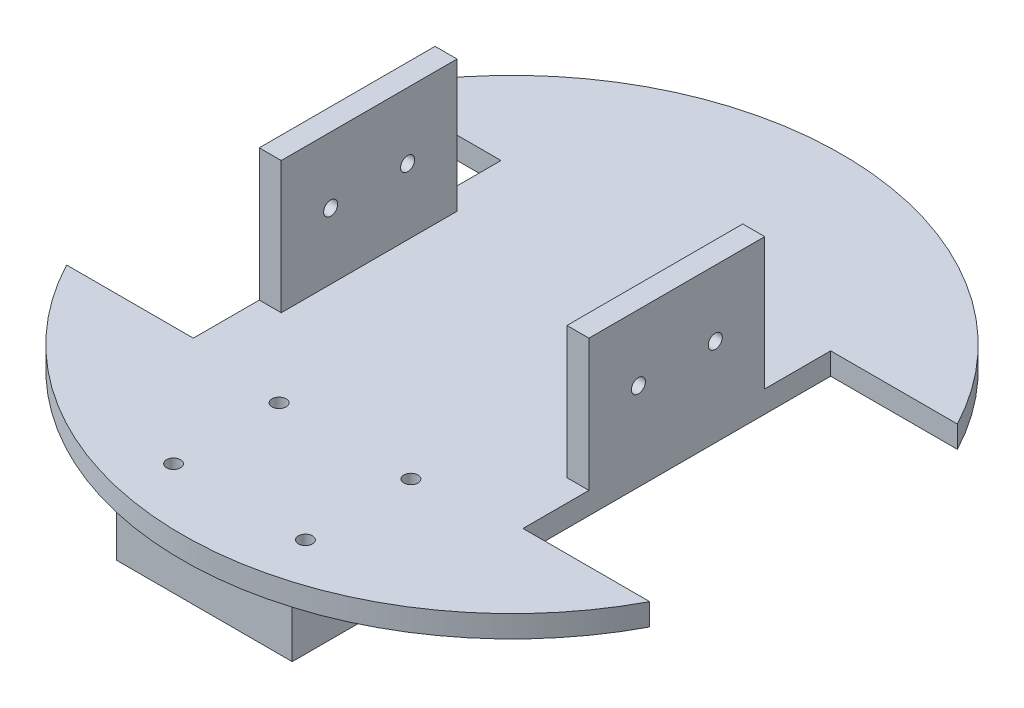
ISO-10303-21;
HEADER;
FILE_DESCRIPTION(('STEP AP214'),'2;1');
FILE_NAME('part.step','',(''),(''),'','','');
FILE_SCHEMA(('AUTOMOTIVE_DESIGN { 1 0 10303 214 1 1 1 1 }'));
ENDSEC;
DATA;
#1=APPLICATION_CONTEXT('core data for automotive mechanical design processes');
#2=APPLICATION_PROTOCOL_DEFINITION('international standard','automotive_design',2000,#1);
#3=PRODUCT_CONTEXT('',#1,'mechanical');
#4=PRODUCT('Part','Part','',(#3));
#5=PRODUCT_RELATED_PRODUCT_CATEGORY('part','',(#4));
#6=PRODUCT_DEFINITION_FORMATION('','',#4);
#7=PRODUCT_DEFINITION_CONTEXT('part definition',#1,'design');
#8=PRODUCT_DEFINITION('design','',#6,#7);
#9=PRODUCT_DEFINITION_SHAPE('','',#8);
#10=(LENGTH_UNIT() NAMED_UNIT(*) SI_UNIT(.MILLI.,.METRE.));
#11=(NAMED_UNIT(*) PLANE_ANGLE_UNIT() SI_UNIT($,.RADIAN.));
#12=(NAMED_UNIT(*) SI_UNIT($,.STERADIAN.) SOLID_ANGLE_UNIT());
#13=UNCERTAINTY_MEASURE_WITH_UNIT(LENGTH_MEASURE(1.E-05),#10,'distance_accuracy_value','');
#14=(GEOMETRIC_REPRESENTATION_CONTEXT(3) GLOBAL_UNCERTAINTY_ASSIGNED_CONTEXT((#13)) GLOBAL_UNIT_ASSIGNED_CONTEXT((#10,
#11,#12)) REPRESENTATION_CONTEXT('',''));
#15=CARTESIAN_POINT('',(0.,0.,0.));
#16=DIRECTION('',(0.,0.,1.));
#17=DIRECTION('',(1.,0.,0.));
#18=AXIS2_PLACEMENT_3D('',#15,#16,#17);
#19=CARTESIAN_POINT('',(0.,0.,0.));
#20=DIRECTION('',(0.,1.,0.));
#21=DIRECTION('',(0.,0.,1.));
#22=AXIS2_PLACEMENT_3D('',#19,#20,#21);
#23=PLANE('',#22);
#24=DIRECTION('',(0.,0.,1.));
#25=VECTOR('',#24,1.);
#26=CARTESIAN_POINT('',(37.5,0.,-35.));
#27=LINE('',#26,#25);
#28=CARTESIAN_POINT('',(37.5,0.,-35.));
#29=VERTEX_POINT('',#28);
#30=CARTESIAN_POINT('',(37.5,0.,35.));
#31=VERTEX_POINT('',#30);
#32=EDGE_CURVE('E362',#29,#31,#27,.T.);
#33=ORIENTED_EDGE('',*,*,#32,.T.);
#34=DIRECTION('',(1.,0.,0.));
#35=VECTOR('',#34,1.);
#36=CARTESIAN_POINT('',(37.5,0.,35.));
#37=LINE('',#36,#35);
#38=CARTESIAN_POINT('',(66.332495807108,0.,35.));
#39=VERTEX_POINT('',#38);
#40=EDGE_CURVE('E365',#31,#39,#37,.T.);
#41=ORIENTED_EDGE('',*,*,#40,.T.);
#42=CARTESIAN_POINT('',(0.,0.,0.));
#43=DIRECTION('',(0.,1.,0.));
#44=DIRECTION('',(0.,0.,1.));
#45=AXIS2_PLACEMENT_3D('',#42,#43,#44);
#46=CIRCLE('',#45,75.);
#47=CARTESIAN_POINT('',(-66.332495807108,0.,35.));
#48=VERTEX_POINT('',#47);
#49=EDGE_CURVE('E413',#48,#39,#46,.T.);
#50=ORIENTED_EDGE('',*,*,#49,.F.);
#51=DIRECTION('',(1.,0.,0.));
#52=VECTOR('',#51,1.);
#53=CARTESIAN_POINT('',(0.,0.,35.));
#54=LINE('',#53,#52);
#55=CARTESIAN_POINT('',(-37.5,0.,35.));
#56=VERTEX_POINT('',#55);
#57=EDGE_CURVE('E122',#48,#56,#54,.T.);
#58=ORIENTED_EDGE('',*,*,#57,.T.);
#59=DIRECTION('',(0.,0.,-1.));
#60=VECTOR('',#59,1.);
#61=CARTESIAN_POINT('',(-37.5,0.,-35.));
#62=LINE('',#61,#60);
#63=CARTESIAN_POINT('',(-37.5,0.,-35.));
#64=VERTEX_POINT('',#63);
#65=EDGE_CURVE('E387',#56,#64,#62,.T.);
#66=ORIENTED_EDGE('',*,*,#65,.T.);
#67=DIRECTION('',(-1.,0.,0.));
#68=VECTOR('',#67,1.);
#69=CARTESIAN_POINT('',(-37.5,0.,-35.));
#70=LINE('',#69,#68);
#71=CARTESIAN_POINT('',(-66.332495807108,0.,-35.));
#72=VERTEX_POINT('',#71);
#73=EDGE_CURVE('E399',#64,#72,#70,.T.);
#74=ORIENTED_EDGE('',*,*,#73,.T.);
#75=CARTESIAN_POINT('',(66.332495807108,0.,-35.));
#76=VERTEX_POINT('',#75);
#77=EDGE_CURVE('E418',#76,#72,#46,.T.);
#78=ORIENTED_EDGE('',*,*,#77,.F.);
#79=DIRECTION('',(-1.,0.,0.));
#80=VECTOR('',#79,1.);
#81=CARTESIAN_POINT('',(0.,0.,-35.));
#82=LINE('',#81,#80);
#83=EDGE_CURVE('E12',#76,#29,#82,.T.);
#84=ORIENTED_EDGE('',*,*,#83,.T.);
#85=EDGE_LOOP('',(#33,#41,#50,#58,#66,#74,#78,#84));
#86=FACE_BOUND('',#85,.T.);
#87=DIRECTION('',(0.,0.,1.));
#88=VECTOR('',#87,1.);
#89=CARTESIAN_POINT('',(20.,0.,70.));
#90=LINE('',#89,#88);
#91=CARTESIAN_POINT('',(20.,0.,30.));
#92=VERTEX_POINT('',#91);
#93=CARTESIAN_POINT('',(20.,0.,70.));
#94=VERTEX_POINT('',#93);
#95=EDGE_CURVE('E271',#92,#94,#90,.T.);
#96=ORIENTED_EDGE('',*,*,#95,.F.);
#97=DIRECTION('',(1.,0.,0.));
#98=VECTOR('',#97,1.);
#99=CARTESIAN_POINT('',(-20.,0.,30.));
#100=LINE('',#99,#98);
#101=CARTESIAN_POINT('',(-20.,0.,30.));
#102=VERTEX_POINT('',#101);
#103=EDGE_CURVE('E268',#102,#92,#100,.T.);
#104=ORIENTED_EDGE('',*,*,#103,.F.);
#105=DIRECTION('',(0.,0.,-1.));
#106=VECTOR('',#105,1.);
#107=CARTESIAN_POINT('',(-20.,0.,70.));
#108=LINE('',#107,#106);
#109=CARTESIAN_POINT('',(-20.,0.,70.));
#110=VERTEX_POINT('',#109);
#111=EDGE_CURVE('E134',#110,#102,#108,.T.);
#112=ORIENTED_EDGE('',*,*,#111,.F.);
#113=DIRECTION('',(-1.,0.,0.));
#114=VECTOR('',#113,1.);
#115=CARTESIAN_POINT('',(-20.,0.,70.));
#116=LINE('',#115,#114);
#117=EDGE_CURVE('E129',#94,#110,#116,.T.);
#118=ORIENTED_EDGE('',*,*,#117,.F.);
#119=EDGE_LOOP('',(#96,#104,#112,#118));
#120=FACE_BOUND('',#119,.T.);
#121=ADVANCED_FACE('F114',(#86,#120),#23,.F.);
#122=CARTESIAN_POINT('',(0.,4.99999999999998,0.));
#123=DIRECTION('',(0.,1.,0.));
#124=DIRECTION('',(0.,0.,1.));
#125=AXIS2_PLACEMENT_3D('',#122,#123,#124);
#126=PLANE('',#125);
#127=CARTESIAN_POINT('',(15.,4.99999999999998,62.));
#128=DIRECTION('',(0.,1.,0.));
#129=DIRECTION('',(0.,0.,1.));
#130=AXIS2_PLACEMENT_3D('',#127,#128,#129);
#131=CIRCLE('',#130,1.60000000000001);
#132=CARTESIAN_POINT('',(15.,4.99999999999998,63.6));
#133=VERTEX_POINT('',#132);
#134=EDGE_CURVE('E732',#133,#133,#131,.T.);
#135=ORIENTED_EDGE('',*,*,#134,.F.);
#136=EDGE_LOOP('',(#135));
#137=FACE_BOUND('',#136,.T.);
#138=CARTESIAN_POINT('',(-15.,4.99999999999998,38.));
#139=DIRECTION('',(0.,1.,0.));
#140=DIRECTION('',(0.,0.,1.));
#141=AXIS2_PLACEMENT_3D('',#138,#139,#140);
#142=CIRCLE('',#141,1.6);
#143=CARTESIAN_POINT('',(-15.,4.99999999999998,39.6));
#144=VERTEX_POINT('',#143);
#145=EDGE_CURVE('E752',#144,#144,#142,.T.);
#146=ORIENTED_EDGE('',*,*,#145,.F.);
#147=EDGE_LOOP('',(#146));
#148=FACE_BOUND('',#147,.T.);
#149=CARTESIAN_POINT('',(15.,4.99999999999998,38.));
#150=DIRECTION('',(0.,1.,0.));
#151=DIRECTION('',(0.,0.,1.));
#152=AXIS2_PLACEMENT_3D('',#149,#150,#151);
#153=CIRCLE('',#152,1.6);
#154=CARTESIAN_POINT('',(15.,4.99999999999998,39.6));
#155=VERTEX_POINT('',#154);
#156=EDGE_CURVE('E749',#155,#155,#153,.T.);
#157=ORIENTED_EDGE('',*,*,#156,.F.);
#158=EDGE_LOOP('',(#157));
#159=FACE_BOUND('',#158,.T.);
#160=CARTESIAN_POINT('',(-15.,4.99999999999998,62.));
#161=DIRECTION('',(0.,1.,0.));
#162=DIRECTION('',(0.,0.,1.));
#163=AXIS2_PLACEMENT_3D('',#160,#161,#162);
#164=CIRCLE('',#163,1.6);
#165=CARTESIAN_POINT('',(-15.,4.99999999999998,63.6));
#166=VERTEX_POINT('',#165);
#167=EDGE_CURVE('E740',#166,#166,#164,.T.);
#168=ORIENTED_EDGE('',*,*,#167,.F.);
#169=EDGE_LOOP('',(#168));
#170=FACE_BOUND('',#169,.T.);
#171=DIRECTION('',(1.,0.,0.));
#172=VECTOR('',#171,1.);
#173=CARTESIAN_POINT('',(37.5,4.99999999999998,-20.));
#174=LINE('',#173,#172);
#175=CARTESIAN_POINT('',(32.5,4.99999999999998,-20.));
#176=VERTEX_POINT('',#175);
#177=CARTESIAN_POINT('',(37.5,4.99999999999998,-20.));
#178=VERTEX_POINT('',#177);
#179=EDGE_CURVE('E289',#176,#178,#174,.T.);
#180=ORIENTED_EDGE('',*,*,#179,.T.);
#181=DIRECTION('',(0.,0.,1.));
#182=VECTOR('',#181,1.);
#183=CARTESIAN_POINT('',(37.5,4.99999999999998,-35.));
#184=LINE('',#183,#182);
#185=CARTESIAN_POINT('',(37.5,4.99999999999998,-35.));
#186=VERTEX_POINT('',#185);
#187=EDGE_CURVE('E374',#186,#178,#184,.T.);
#188=ORIENTED_EDGE('',*,*,#187,.F.);
#189=DIRECTION('',(-1.,0.,0.));
#190=VECTOR('',#189,1.);
#191=CARTESIAN_POINT('',(37.5,4.99999999999998,-35.));
#192=LINE('',#191,#190);
#193=CARTESIAN_POINT('',(66.332495807108,4.99999999999998,-35.));
#194=VERTEX_POINT('',#193);
#195=EDGE_CURVE('E370',#194,#186,#192,.T.);
#196=ORIENTED_EDGE('',*,*,#195,.F.);
#197=CARTESIAN_POINT('',(0.,4.99999999999998,0.));
#198=DIRECTION('',(0.,1.,0.));
#199=DIRECTION('',(0.,0.,1.));
#200=AXIS2_PLACEMENT_3D('',#197,#198,#199);
#201=CIRCLE('',#200,75.);
#202=CARTESIAN_POINT('',(-66.332495807108,4.99999999999998,-35.));
#203=VERTEX_POINT('',#202);
#204=EDGE_CURVE('E417',#194,#203,#201,.T.);
#205=ORIENTED_EDGE('',*,*,#204,.T.);
#206=DIRECTION('',(-1.,0.,0.));
#207=VECTOR('',#206,1.);
#208=CARTESIAN_POINT('',(-37.5,4.99999999999998,-35.));
#209=LINE('',#208,#207);
#210=CARTESIAN_POINT('',(-37.5,4.99999999999998,-35.));
#211=VERTEX_POINT('',#210);
#212=EDGE_CURVE('E373',#211,#203,#209,.T.);
#213=ORIENTED_EDGE('',*,*,#212,.F.);
#214=DIRECTION('',(0.,0.,-1.));
#215=VECTOR('',#214,1.);
#216=CARTESIAN_POINT('',(-37.5,4.99999999999998,-35.));
#217=LINE('',#216,#215);
#218=CARTESIAN_POINT('',(-37.5,4.99999999999998,-20.));
#219=VERTEX_POINT('',#218);
#220=EDGE_CURVE('E394',#219,#211,#217,.T.);
#221=ORIENTED_EDGE('',*,*,#220,.F.);
#222=DIRECTION('',(-1.,0.,0.));
#223=VECTOR('',#222,1.);
#224=CARTESIAN_POINT('',(-37.5,4.99999999999998,-20.));
#225=LINE('',#224,#223);
#226=CARTESIAN_POINT('',(-32.5,4.99999999999998,-20.));
#227=VERTEX_POINT('',#226);
#228=EDGE_CURVE('E336',#227,#219,#225,.T.);
#229=ORIENTED_EDGE('',*,*,#228,.F.);
#230=DIRECTION('',(0.,0.,-1.));
#231=VECTOR('',#230,1.);
#232=CARTESIAN_POINT('',(-32.5,4.99999999999998,-20.));
#233=LINE('',#232,#231);
#234=CARTESIAN_POINT('',(-32.5,4.99999999999998,20.));
#235=VERTEX_POINT('',#234);
#236=EDGE_CURVE('E345',#235,#227,#233,.T.);
#237=ORIENTED_EDGE('',*,*,#236,.F.);
#238=DIRECTION('',(1.,0.,0.));
#239=VECTOR('',#238,1.);
#240=CARTESIAN_POINT('',(-37.5,4.99999999999998,20.));
#241=LINE('',#240,#239);
#242=CARTESIAN_POINT('',(-37.5,4.99999999999998,20.));
#243=VERTEX_POINT('',#242);
#244=EDGE_CURVE('E331',#243,#235,#241,.T.);
#245=ORIENTED_EDGE('',*,*,#244,.F.);
#246=CARTESIAN_POINT('',(-37.5,4.99999999999998,35.));
#247=VERTEX_POINT('',#246);
#248=EDGE_CURVE('E390',#247,#243,#217,.T.);
#249=ORIENTED_EDGE('',*,*,#248,.F.);
#250=DIRECTION('',(1.,0.,0.));
#251=VECTOR('',#250,1.);
#252=CARTESIAN_POINT('',(-37.5,4.99999999999998,35.));
#253=LINE('',#252,#251);
#254=CARTESIAN_POINT('',(-66.332495807108,4.99999999999998,35.));
#255=VERTEX_POINT('',#254);
#256=EDGE_CURVE('E393',#255,#247,#253,.T.);
#257=ORIENTED_EDGE('',*,*,#256,.F.);
#258=CARTESIAN_POINT('',(66.332495807108,4.99999999999998,35.));
#259=VERTEX_POINT('',#258);
#260=EDGE_CURVE('E414',#255,#259,#201,.T.);
#261=ORIENTED_EDGE('',*,*,#260,.T.);
#262=DIRECTION('',(1.,0.,0.));
#263=VECTOR('',#262,1.);
#264=CARTESIAN_POINT('',(37.5,4.99999999999998,35.));
#265=LINE('',#264,#263);
#266=CARTESIAN_POINT('',(37.5,4.99999999999998,35.));
#267=VERTEX_POINT('',#266);
#268=EDGE_CURVE('E366',#267,#259,#265,.T.);
#269=ORIENTED_EDGE('',*,*,#268,.F.);
#270=CARTESIAN_POINT('',(37.5,4.99999999999998,20.));
#271=VERTEX_POINT('',#270);
#272=EDGE_CURVE('E372',#271,#267,#184,.T.);
#273=ORIENTED_EDGE('',*,*,#272,.F.);
#274=DIRECTION('',(-1.,0.,0.));
#275=VECTOR('',#274,1.);
#276=CARTESIAN_POINT('',(37.5,4.99999999999998,20.));
#277=LINE('',#276,#275);
#278=CARTESIAN_POINT('',(32.5,4.99999999999998,20.));
#279=VERTEX_POINT('',#278);
#280=EDGE_CURVE('E294',#271,#279,#277,.T.);
#281=ORIENTED_EDGE('',*,*,#280,.T.);
#282=DIRECTION('',(0.,0.,-1.));
#283=VECTOR('',#282,1.);
#284=CARTESIAN_POINT('',(32.5,4.99999999999998,-20.));
#285=LINE('',#284,#283);
#286=EDGE_CURVE('E306',#279,#176,#285,.T.);
#287=ORIENTED_EDGE('',*,*,#286,.T.);
#288=EDGE_LOOP('',(#180,#188,#196,#205,#213,#221,#229,#237,#245,#249,#257,#261,#269,#273,#281,#287));
#289=FACE_BOUND('',#288,.T.);
#290=ADVANCED_FACE('F428',(#137,#148,#159,#170,#289),#126,.T.);
#291=CARTESIAN_POINT('',(0.,4.99999999999998,0.));
#292=DIRECTION('',(0.,-1.,0.));
#293=DIRECTION('',(0.,0.,-1.));
#294=AXIS2_PLACEMENT_3D('',#291,#292,#293);
#295=CYLINDRICAL_SURFACE('',#294,75.);
#296=ORIENTED_EDGE('',*,*,#49,.T.);
#297=DIRECTION('',(0.,-1.,0.));
#298=VECTOR('',#297,1.);
#299=CARTESIAN_POINT('',(66.332495807108,4.99999999999998,35.));
#300=LINE('',#299,#298);
#301=EDGE_CURVE('E410',#39,#259,#300,.F.);
#302=ORIENTED_EDGE('',*,*,#301,.T.);
#303=ORIENTED_EDGE('',*,*,#260,.F.);
#304=DIRECTION('',(0.,-1.,0.));
#305=VECTOR('',#304,1.);
#306=CARTESIAN_POINT('',(-66.332495807108,4.99999999999998,35.));
#307=LINE('',#306,#305);
#308=EDGE_CURVE('E381',#255,#48,#307,.T.);
#309=ORIENTED_EDGE('',*,*,#308,.T.);
#310=EDGE_LOOP('',(#296,#302,#303,#309));
#311=FACE_BOUND('',#310,.T.);
#312=ADVANCED_FACE('F116',(#311),#295,.T.);
#313=ORIENTED_EDGE('',*,*,#204,.F.);
#314=DIRECTION('',(0.,-1.,0.));
#315=VECTOR('',#314,1.);
#316=CARTESIAN_POINT('',(66.332495807108,4.99999999999998,-35.));
#317=LINE('',#316,#315);
#318=EDGE_CURVE('E407',#194,#76,#317,.T.);
#319=ORIENTED_EDGE('',*,*,#318,.T.);
#320=ORIENTED_EDGE('',*,*,#77,.T.);
#321=DIRECTION('',(0.,-1.,0.));
#322=VECTOR('',#321,1.);
#323=CARTESIAN_POINT('',(-66.332495807108,4.99999999999998,-35.));
#324=LINE('',#323,#322);
#325=EDGE_CURVE('E404',#72,#203,#324,.F.);
#326=ORIENTED_EDGE('',*,*,#325,.T.);
#327=EDGE_LOOP('',(#313,#319,#320,#326));
#328=FACE_BOUND('',#327,.T.);
#329=ADVANCED_FACE('F431',(#328),#295,.T.);
#330=CARTESIAN_POINT('',(-37.5,0.,-35.));
#331=DIRECTION('',(0.,0.,-1.));
#332=DIRECTION('',(-1.,0.,0.));
#333=AXIS2_PLACEMENT_3D('',#330,#331,#332);
#334=PLANE('',#333);
#335=ORIENTED_EDGE('',*,*,#73,.F.);
#336=DIRECTION('',(0.,1.,0.));
#337=VECTOR('',#336,1.);
#338=CARTESIAN_POINT('',(-37.5,0.,-35.));
#339=LINE('',#338,#337);
#340=EDGE_CURVE('E361',#64,#211,#339,.T.);
#341=ORIENTED_EDGE('',*,*,#340,.T.);
#342=ORIENTED_EDGE('',*,*,#212,.T.);
#343=ORIENTED_EDGE('',*,*,#325,.F.);
#344=EDGE_LOOP('',(#335,#341,#342,#343));
#345=FACE_BOUND('',#344,.T.);
#346=ADVANCED_FACE('F436',(#345),#334,.F.);
#347=CARTESIAN_POINT('',(-37.5,0.,35.));
#348=DIRECTION('',(0.,0.,1.));
#349=DIRECTION('',(1.,0.,0.));
#350=AXIS2_PLACEMENT_3D('',#347,#348,#349);
#351=PLANE('',#350);
#352=ORIENTED_EDGE('',*,*,#256,.T.);
#353=DIRECTION('',(0.,1.,0.));
#354=VECTOR('',#353,1.);
#355=CARTESIAN_POINT('',(-37.5,0.,35.));
#356=LINE('',#355,#354);
#357=EDGE_CURVE('E384',#56,#247,#356,.T.);
#358=ORIENTED_EDGE('',*,*,#357,.F.);
#359=ORIENTED_EDGE('',*,*,#57,.F.);
#360=ORIENTED_EDGE('',*,*,#308,.F.);
#361=EDGE_LOOP('',(#352,#358,#359,#360));
#362=FACE_BOUND('',#361,.T.);
#363=ADVANCED_FACE('F442',(#362),#351,.F.);
#364=CARTESIAN_POINT('',(-37.5,0.,-35.));
#365=DIRECTION('',(1.,0.,0.));
#366=DIRECTION('',(0.,0.,-1.));
#367=AXIS2_PLACEMENT_3D('',#364,#365,#366);
#368=PLANE('',#367);
#369=CARTESIAN_POINT('',(-37.5,20.,8.75));
#370=DIRECTION('',(1.,0.,0.));
#371=DIRECTION('',(0.,0.,-1.));
#372=AXIS2_PLACEMENT_3D('',#369,#370,#371);
#373=CIRCLE('',#372,1.6);
#374=CARTESIAN_POINT('',(-37.5,20.,7.15));
#375=VERTEX_POINT('',#374);
#376=EDGE_CURVE('E328',#375,#375,#373,.T.);
#377=ORIENTED_EDGE('',*,*,#376,.T.);
#378=EDGE_LOOP('',(#377));
#379=FACE_BOUND('',#378,.T.);
#380=CARTESIAN_POINT('',(-37.5,20.,-8.75));
#381=DIRECTION('',(1.,0.,0.));
#382=DIRECTION('',(0.,0.,-1.));
#383=AXIS2_PLACEMENT_3D('',#380,#381,#382);
#384=CIRCLE('',#383,1.6);
#385=CARTESIAN_POINT('',(-37.5,20.,-10.35));
#386=VERTEX_POINT('',#385);
#387=EDGE_CURVE('E323',#386,#386,#384,.T.);
#388=ORIENTED_EDGE('',*,*,#387,.T.);
#389=EDGE_LOOP('',(#388));
#390=FACE_BOUND('',#389,.T.);
#391=ORIENTED_EDGE('',*,*,#248,.T.);
#392=DIRECTION('',(0.,-1.,0.));
#393=VECTOR('',#392,1.);
#394=CARTESIAN_POINT('',(-37.5,35.,20.));
#395=LINE('',#394,#393);
#396=CARTESIAN_POINT('',(-37.5,35.,20.));
#397=VERTEX_POINT('',#396);
#398=EDGE_CURVE('E358',#397,#243,#395,.T.);
#399=ORIENTED_EDGE('',*,*,#398,.F.);
#400=DIRECTION('',(0.,0.,1.));
#401=VECTOR('',#400,1.);
#402=CARTESIAN_POINT('',(-37.5,35.,-20.));
#403=LINE('',#402,#401);
#404=CARTESIAN_POINT('',(-37.5,35.,-20.));
#405=VERTEX_POINT('',#404);
#406=EDGE_CURVE('E332',#405,#397,#403,.T.);
#407=ORIENTED_EDGE('',*,*,#406,.F.);
#408=DIRECTION('',(0.,-1.,0.));
#409=VECTOR('',#408,1.);
#410=CARTESIAN_POINT('',(-37.5,35.,-20.));
#411=LINE('',#410,#409);
#412=EDGE_CURVE('E342',#405,#219,#411,.T.);
#413=ORIENTED_EDGE('',*,*,#412,.T.);
#414=ORIENTED_EDGE('',*,*,#220,.T.);
#415=ORIENTED_EDGE('',*,*,#340,.F.);
#416=ORIENTED_EDGE('',*,*,#65,.F.);
#417=ORIENTED_EDGE('',*,*,#357,.T.);
#418=EDGE_LOOP('',(#391,#399,#407,#413,#414,#415,#416,#417));
#419=FACE_BOUND('',#418,.T.);
#420=ADVANCED_FACE('F439',(#379,#390,#419),#368,.F.);
#421=CARTESIAN_POINT('',(37.5,0.,-35.));
#422=DIRECTION('',(0.,0.,-1.));
#423=DIRECTION('',(-1.,0.,0.));
#424=AXIS2_PLACEMENT_3D('',#421,#422,#423);
#425=PLANE('',#424);
#426=ORIENTED_EDGE('',*,*,#195,.T.);
#427=DIRECTION('',(0.,1.,0.));
#428=VECTOR('',#427,1.);
#429=CARTESIAN_POINT('',(37.5,0.,-35.));
#430=LINE('',#429,#428);
#431=EDGE_CURVE('E369',#29,#186,#430,.T.);
#432=ORIENTED_EDGE('',*,*,#431,.F.);
#433=ORIENTED_EDGE('',*,*,#83,.F.);
#434=ORIENTED_EDGE('',*,*,#318,.F.);
#435=EDGE_LOOP('',(#426,#432,#433,#434));
#436=FACE_BOUND('',#435,.T.);
#437=ADVANCED_FACE('F454',(#436),#425,.F.);
#438=CARTESIAN_POINT('',(37.5,0.,-35.));
#439=DIRECTION('',(-1.,0.,0.));
#440=DIRECTION('',(0.,0.,1.));
#441=AXIS2_PLACEMENT_3D('',#438,#439,#440);
#442=PLANE('',#441);
#443=CARTESIAN_POINT('',(37.5,20.,8.75));
#444=DIRECTION('',(-1.,0.,0.));
#445=DIRECTION('',(0.,0.,1.));
#446=AXIS2_PLACEMENT_3D('',#443,#444,#445);
#447=CIRCLE('',#446,1.6);
#448=CARTESIAN_POINT('',(37.5,20.,10.35));
#449=VERTEX_POINT('',#448);
#450=EDGE_CURVE('E286',#449,#449,#447,.F.);
#451=ORIENTED_EDGE('',*,*,#450,.F.);
#452=EDGE_LOOP('',(#451));
#453=FACE_BOUND('',#452,.T.);
#454=CARTESIAN_POINT('',(37.5,20.,-8.75));
#455=DIRECTION('',(-1.,0.,0.));
#456=DIRECTION('',(0.,0.,1.));
#457=AXIS2_PLACEMENT_3D('',#454,#455,#456);
#458=CIRCLE('',#457,1.6);
#459=CARTESIAN_POINT('',(37.5,20.,-7.15));
#460=VERTEX_POINT('',#459);
#461=EDGE_CURVE('E282',#460,#460,#458,.F.);
#462=ORIENTED_EDGE('',*,*,#461,.F.);
#463=EDGE_LOOP('',(#462));
#464=FACE_BOUND('',#463,.T.);
#465=ORIENTED_EDGE('',*,*,#187,.T.);
#466=DIRECTION('',(0.,-1.,0.));
#467=VECTOR('',#466,1.);
#468=CARTESIAN_POINT('',(37.5,35.,-20.));
#469=LINE('',#468,#467);
#470=CARTESIAN_POINT('',(37.5,35.,-20.));
#471=VERTEX_POINT('',#470);
#472=EDGE_CURVE('E317',#471,#178,#469,.T.);
#473=ORIENTED_EDGE('',*,*,#472,.F.);
#474=DIRECTION('',(0.,0.,1.));
#475=VECTOR('',#474,1.);
#476=CARTESIAN_POINT('',(37.5,35.,-20.));
#477=LINE('',#476,#475);
#478=CARTESIAN_POINT('',(37.5,35.,20.));
#479=VERTEX_POINT('',#478);
#480=EDGE_CURVE('E290',#471,#479,#477,.T.);
#481=ORIENTED_EDGE('',*,*,#480,.T.);
#482=DIRECTION('',(0.,-1.,0.));
#483=VECTOR('',#482,1.);
#484=CARTESIAN_POINT('',(37.5,35.,20.));
#485=LINE('',#484,#483);
#486=EDGE_CURVE('E303',#479,#271,#485,.T.);
#487=ORIENTED_EDGE('',*,*,#486,.T.);
#488=ORIENTED_EDGE('',*,*,#272,.T.);
#489=DIRECTION('',(0.,1.,0.));
#490=VECTOR('',#489,1.);
#491=CARTESIAN_POINT('',(37.5,0.,35.));
#492=LINE('',#491,#490);
#493=EDGE_CURVE('E378',#31,#267,#492,.T.);
#494=ORIENTED_EDGE('',*,*,#493,.F.);
#495=ORIENTED_EDGE('',*,*,#32,.F.);
#496=ORIENTED_EDGE('',*,*,#431,.T.);
#497=EDGE_LOOP('',(#465,#473,#481,#487,#488,#494,#495,#496));
#498=FACE_BOUND('',#497,.T.);
#499=ADVANCED_FACE('F452',(#453,#464,#498),#442,.F.);
#500=CARTESIAN_POINT('',(37.5,0.,35.));
#501=DIRECTION('',(0.,0.,1.));
#502=DIRECTION('',(1.,0.,0.));
#503=AXIS2_PLACEMENT_3D('',#500,#501,#502);
#504=PLANE('',#503);
#505=ORIENTED_EDGE('',*,*,#40,.F.);
#506=ORIENTED_EDGE('',*,*,#493,.T.);
#507=ORIENTED_EDGE('',*,*,#268,.T.);
#508=ORIENTED_EDGE('',*,*,#301,.F.);
#509=EDGE_LOOP('',(#505,#506,#507,#508));
#510=FACE_BOUND('',#509,.T.);
#511=ADVANCED_FACE('F449',(#510),#504,.F.);
#512=CARTESIAN_POINT('',(-37.5,35.,20.));
#513=DIRECTION('',(0.,0.,-1.));
#514=DIRECTION('',(-1.,0.,0.));
#515=AXIS2_PLACEMENT_3D('',#512,#513,#514);
#516=PLANE('',#515);
#517=ORIENTED_EDGE('',*,*,#244,.T.);
#518=DIRECTION('',(0.,-1.,0.));
#519=VECTOR('',#518,1.);
#520=CARTESIAN_POINT('',(-32.5,35.,20.));
#521=LINE('',#520,#519);
#522=CARTESIAN_POINT('',(-32.5,35.,20.));
#523=VERTEX_POINT('',#522);
#524=EDGE_CURVE('E355',#523,#235,#521,.T.);
#525=ORIENTED_EDGE('',*,*,#524,.F.);
#526=DIRECTION('',(1.,0.,0.));
#527=VECTOR('',#526,1.);
#528=CARTESIAN_POINT('',(-37.5,35.,20.));
#529=LINE('',#528,#527);
#530=EDGE_CURVE('E335',#397,#523,#529,.T.);
#531=ORIENTED_EDGE('',*,*,#530,.F.);
#532=ORIENTED_EDGE('',*,*,#398,.T.);
#533=EDGE_LOOP('',(#517,#525,#531,#532));
#534=FACE_BOUND('',#533,.T.);
#535=ADVANCED_FACE('F531',(#534),#516,.F.);
#536=CARTESIAN_POINT('',(-32.5,35.,-20.));
#537=DIRECTION('',(-1.,0.,0.));
#538=DIRECTION('',(0.,0.,1.));
#539=AXIS2_PLACEMENT_3D('',#536,#537,#538);
#540=PLANE('',#539);
#541=CARTESIAN_POINT('',(-32.5,20.,8.75));
#542=DIRECTION('',(1.,0.,0.));
#543=DIRECTION('',(0.,0.,-1.));
#544=AXIS2_PLACEMENT_3D('',#541,#542,#543);
#545=CIRCLE('',#544,1.6);
#546=CARTESIAN_POINT('',(-32.5,20.,7.15));
#547=VERTEX_POINT('',#546);
#548=EDGE_CURVE('E320',#547,#547,#545,.T.);
#549=ORIENTED_EDGE('',*,*,#548,.F.);
#550=EDGE_LOOP('',(#549));
#551=FACE_BOUND('',#550,.T.);
#552=CARTESIAN_POINT('',(-32.5,20.,-8.75));
#553=DIRECTION('',(1.,0.,0.));
#554=DIRECTION('',(0.,0.,-1.));
#555=AXIS2_PLACEMENT_3D('',#552,#553,#554);
#556=CIRCLE('',#555,1.6);
#557=CARTESIAN_POINT('',(-32.5,20.,-10.35));
#558=VERTEX_POINT('',#557);
#559=EDGE_CURVE('E319',#558,#558,#556,.T.);
#560=ORIENTED_EDGE('',*,*,#559,.F.);
#561=EDGE_LOOP('',(#560));
#562=FACE_BOUND('',#561,.T.);
#563=ORIENTED_EDGE('',*,*,#236,.T.);
#564=DIRECTION('',(0.,-1.,0.));
#565=VECTOR('',#564,1.);
#566=CARTESIAN_POINT('',(-32.5,35.,-20.));
#567=LINE('',#566,#565);
#568=CARTESIAN_POINT('',(-32.5,35.,-20.));
#569=VERTEX_POINT('',#568);
#570=EDGE_CURVE('E352',#569,#227,#567,.T.);
#571=ORIENTED_EDGE('',*,*,#570,.F.);
#572=DIRECTION('',(0.,0.,-1.));
#573=VECTOR('',#572,1.);
#574=CARTESIAN_POINT('',(-32.5,35.,-20.));
#575=LINE('',#574,#573);
#576=EDGE_CURVE('E338',#523,#569,#575,.T.);
#577=ORIENTED_EDGE('',*,*,#576,.F.);
#578=ORIENTED_EDGE('',*,*,#524,.T.);
#579=EDGE_LOOP('',(#563,#571,#577,#578));
#580=FACE_BOUND('',#579,.T.);
#581=ADVANCED_FACE('F539',(#551,#562,#580),#540,.F.);
#582=CARTESIAN_POINT('',(-37.5,35.,-20.));
#583=DIRECTION('',(0.,0.,1.));
#584=DIRECTION('',(1.,0.,0.));
#585=AXIS2_PLACEMENT_3D('',#582,#583,#584);
#586=PLANE('',#585);
#587=ORIENTED_EDGE('',*,*,#228,.T.);
#588=ORIENTED_EDGE('',*,*,#412,.F.);
#589=DIRECTION('',(-1.,0.,0.));
#590=VECTOR('',#589,1.);
#591=CARTESIAN_POINT('',(-37.5,35.,-20.));
#592=LINE('',#591,#590);
#593=EDGE_CURVE('E340',#569,#405,#592,.T.);
#594=ORIENTED_EDGE('',*,*,#593,.F.);
#595=ORIENTED_EDGE('',*,*,#570,.T.);
#596=EDGE_LOOP('',(#587,#588,#594,#595));
#597=FACE_BOUND('',#596,.T.);
#598=ADVANCED_FACE('F545',(#597),#586,.F.);
#599=CARTESIAN_POINT('',(0.,35.,0.));
#600=DIRECTION('',(0.,1.,0.));
#601=DIRECTION('',(0.,0.,1.));
#602=AXIS2_PLACEMENT_3D('',#599,#600,#601);
#603=PLANE('',#602);
#604=ORIENTED_EDGE('',*,*,#406,.T.);
#605=ORIENTED_EDGE('',*,*,#530,.T.);
#606=ORIENTED_EDGE('',*,*,#576,.T.);
#607=ORIENTED_EDGE('',*,*,#593,.T.);
#608=EDGE_LOOP('',(#604,#605,#606,#607));
#609=FACE_BOUND('',#608,.T.);
#610=ADVANCED_FACE('F549',(#609),#603,.T.);
#611=CARTESIAN_POINT('',(-75.,20.,-8.75));
#612=DIRECTION('',(1.,0.,0.));
#613=DIRECTION('',(0.,0.,-1.));
#614=AXIS2_PLACEMENT_3D('',#611,#612,#613);
#615=CYLINDRICAL_SURFACE('',#614,1.6);
#616=CARTESIAN_POINT('',(-32.5,20.,-10.35));
#617=CARTESIAN_POINT('',(-32.5520833333333,20.,-10.35));
#618=CARTESIAN_POINT('',(-32.6041666666667,20.,-10.35));
#619=CARTESIAN_POINT('',(-32.7083333333333,20.,-10.35));
#620=CARTESIAN_POINT('',(-32.7604166666667,20.,-10.35));
#621=CARTESIAN_POINT('',(-32.8645833333333,20.,-10.35));
#622=CARTESIAN_POINT('',(-32.9166666666667,20.,-10.35));
#623=CARTESIAN_POINT('',(-33.0208333333333,20.,-10.35));
#624=CARTESIAN_POINT('',(-33.0729166666667,20.,-10.35));
#625=CARTESIAN_POINT('',(-33.1770833333333,20.,-10.35));
#626=CARTESIAN_POINT('',(-33.2291666666667,20.,-10.35));
#627=CARTESIAN_POINT('',(-33.3333333333333,20.,-10.35));
#628=CARTESIAN_POINT('',(-33.3854166666667,20.,-10.35));
#629=CARTESIAN_POINT('',(-33.4895833333333,20.,-10.35));
#630=CARTESIAN_POINT('',(-33.5416666666667,20.,-10.35));
#631=CARTESIAN_POINT('',(-33.6458333333333,20.,-10.35));
#632=CARTESIAN_POINT('',(-33.6979166666667,20.,-10.35));
#633=CARTESIAN_POINT('',(-33.8020833333333,20.,-10.35));
#634=CARTESIAN_POINT('',(-33.8541666666667,20.,-10.35));
#635=CARTESIAN_POINT('',(-33.9583333333333,20.,-10.35));
#636=CARTESIAN_POINT('',(-34.0104166666667,20.,-10.35));
#637=CARTESIAN_POINT('',(-34.1145833333333,20.,-10.35));
#638=CARTESIAN_POINT('',(-34.1666666666667,20.,-10.35));
#639=CARTESIAN_POINT('',(-34.2708333333333,20.,-10.35));
#640=CARTESIAN_POINT('',(-34.3229166666667,20.,-10.35));
#641=CARTESIAN_POINT('',(-34.4270833333333,20.,-10.35));
#642=CARTESIAN_POINT('',(-34.4791666666667,20.,-10.35));
#643=CARTESIAN_POINT('',(-34.5833333333333,20.,-10.35));
#644=CARTESIAN_POINT('',(-34.6354166666667,20.,-10.35));
#645=CARTESIAN_POINT('',(-34.7395833333333,20.,-10.35));
#646=CARTESIAN_POINT('',(-34.7916666666667,20.,-10.35));
#647=CARTESIAN_POINT('',(-34.8958333333333,20.,-10.35));
#648=CARTESIAN_POINT('',(-34.9479166666667,20.,-10.35));
#649=CARTESIAN_POINT('',(-35.0520833333333,20.,-10.35));
#650=CARTESIAN_POINT('',(-35.1041666666667,20.,-10.35));
#651=CARTESIAN_POINT('',(-35.2083333333333,20.,-10.35));
#652=CARTESIAN_POINT('',(-35.2604166666667,20.,-10.35));
#653=CARTESIAN_POINT('',(-35.3645833333333,20.,-10.35));
#654=CARTESIAN_POINT('',(-35.4166666666667,20.,-10.35));
#655=CARTESIAN_POINT('',(-35.5208333333333,20.,-10.35));
#656=CARTESIAN_POINT('',(-35.5729166666667,20.,-10.35));
#657=CARTESIAN_POINT('',(-35.6770833333333,20.,-10.35));
#658=CARTESIAN_POINT('',(-35.7291666666667,20.,-10.35));
#659=CARTESIAN_POINT('',(-35.8333333333333,20.,-10.35));
#660=CARTESIAN_POINT('',(-35.8854166666667,20.,-10.35));
#661=CARTESIAN_POINT('',(-35.9895833333333,20.,-10.35));
#662=CARTESIAN_POINT('',(-36.0416666666667,20.,-10.35));
#663=CARTESIAN_POINT('',(-36.1458333333333,20.,-10.35));
#664=CARTESIAN_POINT('',(-36.1979166666667,20.,-10.35));
#665=CARTESIAN_POINT('',(-36.3020833333333,20.,-10.35));
#666=CARTESIAN_POINT('',(-36.3541666666667,20.,-10.35));
#667=CARTESIAN_POINT('',(-36.4583333333333,20.,-10.35));
#668=CARTESIAN_POINT('',(-36.5104166666667,20.,-10.35));
#669=CARTESIAN_POINT('',(-36.6145833333333,20.,-10.35));
#670=CARTESIAN_POINT('',(-36.6666666666667,20.,-10.35));
#671=CARTESIAN_POINT('',(-36.7708333333333,20.,-10.35));
#672=CARTESIAN_POINT('',(-36.8229166666667,20.,-10.35));
#673=CARTESIAN_POINT('',(-36.9270833333333,20.,-10.35));
#674=CARTESIAN_POINT('',(-36.9791666666667,20.,-10.35));
#675=CARTESIAN_POINT('',(-37.0833333333333,20.,-10.35));
#676=CARTESIAN_POINT('',(-37.1354166666667,20.,-10.35));
#677=CARTESIAN_POINT('',(-37.2395833333333,20.,-10.35));
#678=CARTESIAN_POINT('',(-37.2916666666667,20.,-10.35));
#679=CARTESIAN_POINT('',(-37.3958333333333,20.,-10.35));
#680=CARTESIAN_POINT('',(-37.4479166666667,20.,-10.35));
#681=CARTESIAN_POINT('',(-37.5,20.,-10.35));
#682=B_SPLINE_CURVE_WITH_KNOTS('',3,(#616,#617,#618,#619,#620,#621,#622,#623,#624,#625,#626,
#627,#628,#629,#630,#631,#632,#633,#634,#635,#636,#637,#638,#639,#640,#641,#642,#643,#644,#645,
#646,#647,#648,#649,#650,#651,#652,#653,#654,#655,#656,#657,#658,#659,#660,#661,#662,#663,#664,
#665,#666,#667,#668,#669,#670,#671,#672,#673,#674,#675,#676,#677,#678,#679,#680,#681),
.UNSPECIFIED.,.F.,.F.,(4,2,2,2,2,2,2,2,2,2,2,2,2,2,2,2,2,2,2,2,2,2,2,2,2,2,2,2,2,2,2,2,4),(0.,
0.156249999999997,0.3125,0.468749999999997,0.625000000000001,0.781249999999997,
0.937500000000001,1.09375,1.25,1.40625,1.56249999999999,1.71875,1.87499999999999,2.03125,2.1875,
2.34375,2.5,2.65624999999999,2.8125,2.96874999999999,3.125,3.28124999999999,3.4375,
3.59374999999999,3.74999999999999,3.90624999999999,4.06249999999999,4.21874999999999,
4.37499999999999,4.53124999999999,4.68749999999999,4.84374999999999,4.99999999999999),.UNSPECIFIED.);
#683=EDGE_CURVE('BSEAM557',#558,#386,#682,.T.);
#684=ORIENTED_EDGE('',*,*,#559,.T.);
#685=ORIENTED_EDGE('',*,*,#387,.F.);
#686=ORIENTED_EDGE('',*,*,#683,.T.);
#687=ORIENTED_EDGE('',*,*,#683,.F.);
#688=EDGE_LOOP('',(#684,#686,#685,#687));
#689=FACE_BOUND('',#688,.T.);
#690=ADVANCED_FACE('F557',(#689),#615,.F.);
#691=CARTESIAN_POINT('',(-75.,20.,8.75));
#692=DIRECTION('',(1.,0.,0.));
#693=DIRECTION('',(0.,0.,-1.));
#694=AXIS2_PLACEMENT_3D('',#691,#692,#693);
#695=CYLINDRICAL_SURFACE('',#694,1.6);
#696=CARTESIAN_POINT('',(-32.5,20.,7.15));
#697=CARTESIAN_POINT('',(-32.5520833333333,20.,7.15));
#698=CARTESIAN_POINT('',(-32.6041666666667,20.,7.15));
#699=CARTESIAN_POINT('',(-32.7083333333333,20.,7.15));
#700=CARTESIAN_POINT('',(-32.7604166666667,20.,7.15));
#701=CARTESIAN_POINT('',(-32.8645833333333,20.,7.15));
#702=CARTESIAN_POINT('',(-32.9166666666667,20.,7.15));
#703=CARTESIAN_POINT('',(-33.0208333333333,20.,7.15));
#704=CARTESIAN_POINT('',(-33.0729166666667,20.,7.15));
#705=CARTESIAN_POINT('',(-33.1770833333333,20.,7.15));
#706=CARTESIAN_POINT('',(-33.2291666666667,20.,7.15));
#707=CARTESIAN_POINT('',(-33.3333333333333,20.,7.15));
#708=CARTESIAN_POINT('',(-33.3854166666667,20.,7.15));
#709=CARTESIAN_POINT('',(-33.4895833333333,20.,7.15));
#710=CARTESIAN_POINT('',(-33.5416666666667,20.,7.15));
#711=CARTESIAN_POINT('',(-33.6458333333333,20.,7.15));
#712=CARTESIAN_POINT('',(-33.6979166666667,20.,7.15));
#713=CARTESIAN_POINT('',(-33.8020833333333,20.,7.15));
#714=CARTESIAN_POINT('',(-33.8541666666667,20.,7.15));
#715=CARTESIAN_POINT('',(-33.9583333333333,20.,7.15));
#716=CARTESIAN_POINT('',(-34.0104166666667,20.,7.15));
#717=CARTESIAN_POINT('',(-34.1145833333333,20.,7.15));
#718=CARTESIAN_POINT('',(-34.1666666666667,20.,7.15));
#719=CARTESIAN_POINT('',(-34.2708333333333,20.,7.15));
#720=CARTESIAN_POINT('',(-34.3229166666667,20.,7.15));
#721=CARTESIAN_POINT('',(-34.4270833333333,20.,7.15));
#722=CARTESIAN_POINT('',(-34.4791666666667,20.,7.15));
#723=CARTESIAN_POINT('',(-34.5833333333333,20.,7.15));
#724=CARTESIAN_POINT('',(-34.6354166666667,20.,7.15));
#725=CARTESIAN_POINT('',(-34.7395833333333,20.,7.15));
#726=CARTESIAN_POINT('',(-34.7916666666667,20.,7.15));
#727=CARTESIAN_POINT('',(-34.8958333333333,20.,7.15));
#728=CARTESIAN_POINT('',(-34.9479166666667,20.,7.15));
#729=CARTESIAN_POINT('',(-35.0520833333333,20.,7.15));
#730=CARTESIAN_POINT('',(-35.1041666666667,20.,7.15));
#731=CARTESIAN_POINT('',(-35.2083333333333,20.,7.15));
#732=CARTESIAN_POINT('',(-35.2604166666667,20.,7.15));
#733=CARTESIAN_POINT('',(-35.3645833333333,20.,7.15));
#734=CARTESIAN_POINT('',(-35.4166666666667,20.,7.15));
#735=CARTESIAN_POINT('',(-35.5208333333333,20.,7.15));
#736=CARTESIAN_POINT('',(-35.5729166666667,20.,7.15));
#737=CARTESIAN_POINT('',(-35.6770833333333,20.,7.15));
#738=CARTESIAN_POINT('',(-35.7291666666667,20.,7.15));
#739=CARTESIAN_POINT('',(-35.8333333333333,20.,7.15));
#740=CARTESIAN_POINT('',(-35.8854166666667,20.,7.15));
#741=CARTESIAN_POINT('',(-35.9895833333333,20.,7.15));
#742=CARTESIAN_POINT('',(-36.0416666666667,20.,7.15));
#743=CARTESIAN_POINT('',(-36.1458333333333,20.,7.15));
#744=CARTESIAN_POINT('',(-36.1979166666667,20.,7.15));
#745=CARTESIAN_POINT('',(-36.3020833333333,20.,7.15));
#746=CARTESIAN_POINT('',(-36.3541666666667,20.,7.15));
#747=CARTESIAN_POINT('',(-36.4583333333333,20.,7.15));
#748=CARTESIAN_POINT('',(-36.5104166666667,20.,7.15));
#749=CARTESIAN_POINT('',(-36.6145833333333,20.,7.15));
#750=CARTESIAN_POINT('',(-36.6666666666667,20.,7.15));
#751=CARTESIAN_POINT('',(-36.7708333333333,20.,7.15));
#752=CARTESIAN_POINT('',(-36.8229166666667,20.,7.15));
#753=CARTESIAN_POINT('',(-36.9270833333333,20.,7.15));
#754=CARTESIAN_POINT('',(-36.9791666666667,20.,7.15));
#755=CARTESIAN_POINT('',(-37.0833333333333,20.,7.15));
#756=CARTESIAN_POINT('',(-37.1354166666667,20.,7.15));
#757=CARTESIAN_POINT('',(-37.2395833333333,20.,7.15));
#758=CARTESIAN_POINT('',(-37.2916666666667,20.,7.15));
#759=CARTESIAN_POINT('',(-37.3958333333333,20.,7.15));
#760=CARTESIAN_POINT('',(-37.4479166666667,20.,7.15));
#761=CARTESIAN_POINT('',(-37.5,20.,7.15));
#762=B_SPLINE_CURVE_WITH_KNOTS('',3,(#696,#697,#698,#699,#700,#701,#702,#703,#704,#705,#706,
#707,#708,#709,#710,#711,#712,#713,#714,#715,#716,#717,#718,#719,#720,#721,#722,#723,#724,#725,
#726,#727,#728,#729,#730,#731,#732,#733,#734,#735,#736,#737,#738,#739,#740,#741,#742,#743,#744,
#745,#746,#747,#748,#749,#750,#751,#752,#753,#754,#755,#756,#757,#758,#759,#760,#761),
.UNSPECIFIED.,.F.,.F.,(4,2,2,2,2,2,2,2,2,2,2,2,2,2,2,2,2,2,2,2,2,2,2,2,2,2,2,2,2,2,2,2,4),(0.,
0.156249999999997,0.3125,0.468750000000004,0.625000000000001,0.781249999999997,
0.937500000000001,1.09375,1.25,1.40625,1.5625,1.71875,1.875,2.03125,2.1875,2.34375000000001,2.5,
2.65625,2.8125,2.96875000000001,3.125,3.28125,3.4375,3.59375000000001,3.75,3.90625,4.0625,
4.21875000000001,4.375,4.53125,4.6875,4.84375000000001,5.),.UNSPECIFIED.);
#763=EDGE_CURVE('BSEAM575',#547,#375,#762,.T.);
#764=ORIENTED_EDGE('',*,*,#548,.T.);
#765=ORIENTED_EDGE('',*,*,#376,.F.);
#766=ORIENTED_EDGE('',*,*,#763,.T.);
#767=ORIENTED_EDGE('',*,*,#763,.F.);
#768=EDGE_LOOP('',(#764,#766,#765,#767));
#769=FACE_BOUND('',#768,.T.);
#770=ADVANCED_FACE('F575',(#769),#695,.F.);
#771=CARTESIAN_POINT('',(37.5,35.,-20.));
#772=DIRECTION('',(0.,0.,-1.));
#773=DIRECTION('',(-1.,0.,0.));
#774=AXIS2_PLACEMENT_3D('',#771,#772,#773);
#775=PLANE('',#774);
#776=ORIENTED_EDGE('',*,*,#179,.F.);
#777=DIRECTION('',(0.,-1.,0.));
#778=VECTOR('',#777,1.);
#779=CARTESIAN_POINT('',(32.5,35.,-20.));
#780=LINE('',#779,#778);
#781=CARTESIAN_POINT('',(32.5,35.,-20.));
#782=VERTEX_POINT('',#781);
#783=EDGE_CURVE('E315',#782,#176,#780,.T.);
#784=ORIENTED_EDGE('',*,*,#783,.F.);
#785=DIRECTION('',(1.,0.,0.));
#786=VECTOR('',#785,1.);
#787=CARTESIAN_POINT('',(37.5,35.,-20.));
#788=LINE('',#787,#786);
#789=EDGE_CURVE('E293',#782,#471,#788,.T.);
#790=ORIENTED_EDGE('',*,*,#789,.T.);
#791=ORIENTED_EDGE('',*,*,#472,.T.);
#792=EDGE_LOOP('',(#776,#784,#790,#791));
#793=FACE_BOUND('',#792,.T.);
#794=ADVANCED_FACE('F582',(#793),#775,.T.);
#795=CARTESIAN_POINT('',(32.5,35.,-20.));
#796=DIRECTION('',(-1.,0.,0.));
#797=DIRECTION('',(0.,0.,1.));
#798=AXIS2_PLACEMENT_3D('',#795,#796,#797);
#799=PLANE('',#798);
#800=CARTESIAN_POINT('',(32.5,20.,8.75));
#801=DIRECTION('',(1.,0.,0.));
#802=DIRECTION('',(0.,0.,-1.));
#803=AXIS2_PLACEMENT_3D('',#800,#801,#802);
#804=CIRCLE('',#803,1.6);
#805=CARTESIAN_POINT('',(32.5,20.,7.15));
#806=VERTEX_POINT('',#805);
#807=EDGE_CURVE('E275',#806,#806,#804,.T.);
#808=ORIENTED_EDGE('',*,*,#807,.T.);
#809=EDGE_LOOP('',(#808));
#810=FACE_BOUND('',#809,.T.);
#811=CARTESIAN_POINT('',(32.5,20.,-8.75));
#812=DIRECTION('',(1.,0.,0.));
#813=DIRECTION('',(0.,0.,-1.));
#814=AXIS2_PLACEMENT_3D('',#811,#812,#813);
#815=CIRCLE('',#814,1.6);
#816=CARTESIAN_POINT('',(32.5,20.,-10.35));
#817=VERTEX_POINT('',#816);
#818=EDGE_CURVE('E272',#817,#817,#815,.T.);
#819=ORIENTED_EDGE('',*,*,#818,.T.);
#820=EDGE_LOOP('',(#819));
#821=FACE_BOUND('',#820,.T.);
#822=ORIENTED_EDGE('',*,*,#286,.F.);
#823=DIRECTION('',(0.,-1.,0.));
#824=VECTOR('',#823,1.);
#825=CARTESIAN_POINT('',(32.5,35.,20.));
#826=LINE('',#825,#824);
#827=CARTESIAN_POINT('',(32.5,35.,20.));
#828=VERTEX_POINT('',#827);
#829=EDGE_CURVE('E313',#828,#279,#826,.T.);
#830=ORIENTED_EDGE('',*,*,#829,.F.);
#831=DIRECTION('',(0.,0.,-1.));
#832=VECTOR('',#831,1.);
#833=CARTESIAN_POINT('',(32.5,35.,-20.));
#834=LINE('',#833,#832);
#835=EDGE_CURVE('E297',#828,#782,#834,.T.);
#836=ORIENTED_EDGE('',*,*,#835,.T.);
#837=ORIENTED_EDGE('',*,*,#783,.T.);
#838=EDGE_LOOP('',(#822,#830,#836,#837));
#839=FACE_BOUND('',#838,.T.);
#840=ADVANCED_FACE('F592',(#810,#821,#839),#799,.T.);
#841=CARTESIAN_POINT('',(37.5,35.,20.));
#842=DIRECTION('',(0.,0.,1.));
#843=DIRECTION('',(1.,0.,0.));
#844=AXIS2_PLACEMENT_3D('',#841,#842,#843);
#845=PLANE('',#844);
#846=ORIENTED_EDGE('',*,*,#280,.F.);
#847=ORIENTED_EDGE('',*,*,#486,.F.);
#848=DIRECTION('',(-1.,0.,0.));
#849=VECTOR('',#848,1.);
#850=CARTESIAN_POINT('',(37.5,35.,20.));
#851=LINE('',#850,#849);
#852=EDGE_CURVE('E300',#479,#828,#851,.T.);
#853=ORIENTED_EDGE('',*,*,#852,.T.);
#854=ORIENTED_EDGE('',*,*,#829,.T.);
#855=EDGE_LOOP('',(#846,#847,#853,#854));
#856=FACE_BOUND('',#855,.T.);
#857=ADVANCED_FACE('F601',(#856),#845,.T.);
#858=CARTESIAN_POINT('',(0.,35.,0.));
#859=DIRECTION('',(0.,1.,0.));
#860=DIRECTION('',(0.,0.,1.));
#861=AXIS2_PLACEMENT_3D('',#858,#859,#860);
#862=PLANE('',#861);
#863=ORIENTED_EDGE('',*,*,#480,.F.);
#864=ORIENTED_EDGE('',*,*,#789,.F.);
#865=ORIENTED_EDGE('',*,*,#835,.F.);
#866=ORIENTED_EDGE('',*,*,#852,.F.);
#867=EDGE_LOOP('',(#863,#864,#865,#866));
#868=FACE_BOUND('',#867,.T.);
#869=ADVANCED_FACE('F610',(#868),#862,.T.);
#870=CARTESIAN_POINT('',(66.332495807108,20.,-8.75));
#871=DIRECTION('',(-1.,0.,0.));
#872=DIRECTION('',(0.,0.,1.));
#873=AXIS2_PLACEMENT_3D('',#870,#871,#872);
#874=CYLINDRICAL_SURFACE('',#873,1.6);
#875=ORIENTED_EDGE('',*,*,#818,.F.);
#876=EDGE_LOOP('',(#875));
#877=FACE_BOUND('',#876,.T.);
#878=ORIENTED_EDGE('',*,*,#461,.T.);
#879=EDGE_LOOP('',(#878));
#880=FACE_BOUND('',#879,.T.);
#881=ADVANCED_FACE('F619',(#877,#880),#874,.F.);
#882=CARTESIAN_POINT('',(66.332495807108,20.,8.75));
#883=DIRECTION('',(-1.,0.,0.));
#884=DIRECTION('',(0.,0.,1.));
#885=AXIS2_PLACEMENT_3D('',#882,#883,#884);
#886=CYLINDRICAL_SURFACE('',#885,1.6);
#887=ORIENTED_EDGE('',*,*,#807,.F.);
#888=EDGE_LOOP('',(#887));
#889=FACE_BOUND('',#888,.T.);
#890=ORIENTED_EDGE('',*,*,#450,.T.);
#891=EDGE_LOOP('',(#890));
#892=FACE_BOUND('',#891,.T.);
#893=ADVANCED_FACE('F627',(#889,#892),#886,.F.);
#894=CARTESIAN_POINT('',(20.,-12.5,70.));
#895=DIRECTION('',(-1.,0.,0.));
#896=DIRECTION('',(0.,0.,1.));
#897=AXIS2_PLACEMENT_3D('',#894,#895,#896);
#898=PLANE('',#897);
#899=ORIENTED_EDGE('',*,*,#95,.T.);
#900=DIRECTION('',(0.,1.,0.));
#901=VECTOR('',#900,1.);
#902=CARTESIAN_POINT('',(20.,-12.5,70.));
#903=LINE('',#902,#901);
#904=CARTESIAN_POINT('',(20.,-12.5,70.));
#905=VERTEX_POINT('',#904);
#906=EDGE_CURVE('E252',#905,#94,#903,.T.);
#907=ORIENTED_EDGE('',*,*,#906,.F.);
#908=DIRECTION('',(0.,0.,1.));
#909=VECTOR('',#908,1.);
#910=CARTESIAN_POINT('',(20.,-12.5,70.));
#911=LINE('',#910,#909);
#912=CARTESIAN_POINT('',(20.,-12.5,30.));
#913=VERTEX_POINT('',#912);
#914=EDGE_CURVE('E259',#913,#905,#911,.T.);
#915=ORIENTED_EDGE('',*,*,#914,.F.);
#916=DIRECTION('',(0.,1.,0.));
#917=VECTOR('',#916,1.);
#918=CARTESIAN_POINT('',(20.,-12.5,30.));
#919=LINE('',#918,#917);
#920=EDGE_CURVE('E758',#913,#92,#919,.T.);
#921=ORIENTED_EDGE('',*,*,#920,.T.);
#922=EDGE_LOOP('',(#899,#907,#915,#921));
#923=FACE_BOUND('',#922,.T.);
#924=ADVANCED_FACE('F270',(#923),#898,.F.);
#925=CARTESIAN_POINT('',(-20.,-12.5,70.));
#926=DIRECTION('',(0.,0.,-1.));
#927=DIRECTION('',(-1.,0.,0.));
#928=AXIS2_PLACEMENT_3D('',#925,#926,#927);
#929=PLANE('',#928);
#930=ORIENTED_EDGE('',*,*,#117,.T.);
#931=DIRECTION('',(0.,1.,0.));
#932=VECTOR('',#931,1.);
#933=CARTESIAN_POINT('',(-20.,-12.5,70.));
#934=LINE('',#933,#932);
#935=CARTESIAN_POINT('',(-20.,-12.5,70.));
#936=VERTEX_POINT('',#935);
#937=EDGE_CURVE('E255',#936,#110,#934,.T.);
#938=ORIENTED_EDGE('',*,*,#937,.F.);
#939=DIRECTION('',(-1.,0.,0.));
#940=VECTOR('',#939,1.);
#941=CARTESIAN_POINT('',(-20.,-12.5,70.));
#942=LINE('',#941,#940);
#943=EDGE_CURVE('E248',#905,#936,#942,.T.);
#944=ORIENTED_EDGE('',*,*,#943,.F.);
#945=ORIENTED_EDGE('',*,*,#906,.T.);
#946=EDGE_LOOP('',(#930,#938,#944,#945));
#947=FACE_BOUND('',#946,.T.);
#948=ADVANCED_FACE('F250',(#947),#929,.F.);
#949=CARTESIAN_POINT('',(-20.,-12.5,70.));
#950=DIRECTION('',(1.,0.,0.));
#951=DIRECTION('',(0.,0.,-1.));
#952=AXIS2_PLACEMENT_3D('',#949,#950,#951);
#953=PLANE('',#952);
#954=ORIENTED_EDGE('',*,*,#111,.T.);
#955=DIRECTION('',(0.,1.,0.));
#956=VECTOR('',#955,1.);
#957=CARTESIAN_POINT('',(-20.,-12.5,30.));
#958=LINE('',#957,#956);
#959=CARTESIAN_POINT('',(-20.,-12.5,30.));
#960=VERTEX_POINT('',#959);
#961=EDGE_CURVE('E277',#960,#102,#958,.T.);
#962=ORIENTED_EDGE('',*,*,#961,.F.);
#963=DIRECTION('',(0.,0.,-1.));
#964=VECTOR('',#963,1.);
#965=CARTESIAN_POINT('',(-20.,-12.5,70.));
#966=LINE('',#965,#964);
#967=EDGE_CURVE('E258',#936,#960,#966,.T.);
#968=ORIENTED_EDGE('',*,*,#967,.F.);
#969=ORIENTED_EDGE('',*,*,#937,.T.);
#970=EDGE_LOOP('',(#954,#962,#968,#969));
#971=FACE_BOUND('',#970,.T.);
#972=ADVANCED_FACE('F658',(#971),#953,.F.);
#973=CARTESIAN_POINT('',(-20.,-12.5,30.));
#974=DIRECTION('',(0.,0.,1.));
#975=DIRECTION('',(1.,0.,0.));
#976=AXIS2_PLACEMENT_3D('',#973,#974,#975);
#977=PLANE('',#976);
#978=ORIENTED_EDGE('',*,*,#103,.T.);
#979=ORIENTED_EDGE('',*,*,#920,.F.);
#980=DIRECTION('',(1.,0.,0.));
#981=VECTOR('',#980,1.);
#982=CARTESIAN_POINT('',(-20.,-12.5,30.));
#983=LINE('',#982,#981);
#984=EDGE_CURVE('E264',#960,#913,#983,.T.);
#985=ORIENTED_EDGE('',*,*,#984,.F.);
#986=ORIENTED_EDGE('',*,*,#961,.T.);
#987=EDGE_LOOP('',(#978,#979,#985,#986));
#988=FACE_BOUND('',#987,.T.);
#989=ADVANCED_FACE('F667',(#988),#977,.F.);
#990=CARTESIAN_POINT('',(0.,-12.5,0.));
#991=DIRECTION('',(0.,-1.,0.));
#992=DIRECTION('',(0.,0.,-1.));
#993=AXIS2_PLACEMENT_3D('',#990,#991,#992);
#994=PLANE('',#993);
#995=CARTESIAN_POINT('',(15.,-12.5,62.));
#996=DIRECTION('',(0.,-1.,0.));
#997=DIRECTION('',(0.,0.,-1.));
#998=AXIS2_PLACEMENT_3D('',#995,#996,#997);
#999=CIRCLE('',#998,1.60000000000001);
#1000=CARTESIAN_POINT('',(15.,-12.5,60.4));
#1001=VERTEX_POINT('',#1000);
#1002=EDGE_CURVE('E735',#1001,#1001,#999,.T.);
#1003=ORIENTED_EDGE('',*,*,#1002,.F.);
#1004=EDGE_LOOP('',(#1003));
#1005=FACE_BOUND('',#1004,.T.);
#1006=CARTESIAN_POINT('',(-15.,-12.5,38.));
#1007=DIRECTION('',(0.,-1.,0.));
#1008=DIRECTION('',(0.,0.,-1.));
#1009=AXIS2_PLACEMENT_3D('',#1006,#1007,#1008);
#1010=CIRCLE('',#1009,1.6);
#1011=CARTESIAN_POINT('',(-15.,-12.5,36.4));
#1012=VERTEX_POINT('',#1011);
#1013=EDGE_CURVE('E737',#1012,#1012,#1010,.T.);
#1014=ORIENTED_EDGE('',*,*,#1013,.F.);
#1015=EDGE_LOOP('',(#1014));
#1016=FACE_BOUND('',#1015,.T.);
#1017=CARTESIAN_POINT('',(15.,-12.5,38.));
#1018=DIRECTION('',(0.,-1.,0.));
#1019=DIRECTION('',(0.,0.,-1.));
#1020=AXIS2_PLACEMENT_3D('',#1017,#1018,#1019);
#1021=CIRCLE('',#1020,1.6);
#1022=CARTESIAN_POINT('',(15.,-12.5,36.4));
#1023=VERTEX_POINT('',#1022);
#1024=EDGE_CURVE('E743',#1023,#1023,#1021,.T.);
#1025=ORIENTED_EDGE('',*,*,#1024,.F.);
#1026=EDGE_LOOP('',(#1025));
#1027=FACE_BOUND('',#1026,.T.);
#1028=CARTESIAN_POINT('',(-15.,-12.5,62.));
#1029=DIRECTION('',(0.,-1.,0.));
#1030=DIRECTION('',(0.,0.,-1.));
#1031=AXIS2_PLACEMENT_3D('',#1028,#1029,#1030);
#1032=CIRCLE('',#1031,1.6);
#1033=CARTESIAN_POINT('',(-15.,-12.5,60.4));
#1034=VERTEX_POINT('',#1033);
#1035=EDGE_CURVE('E736',#1034,#1034,#1032,.T.);
#1036=ORIENTED_EDGE('',*,*,#1035,.F.);
#1037=EDGE_LOOP('',(#1036));
#1038=FACE_BOUND('',#1037,.T.);
#1039=ORIENTED_EDGE('',*,*,#914,.T.);
#1040=ORIENTED_EDGE('',*,*,#943,.T.);
#1041=ORIENTED_EDGE('',*,*,#967,.T.);
#1042=ORIENTED_EDGE('',*,*,#984,.T.);
#1043=EDGE_LOOP('',(#1039,#1040,#1041,#1042));
#1044=FACE_BOUND('',#1043,.T.);
#1045=ADVANCED_FACE('F262',(#1005,#1016,#1027,#1038,#1044),#994,.T.);
#1046=CARTESIAN_POINT('',(-15.,35.,62.));
#1047=DIRECTION('',(0.,-1.,0.));
#1048=DIRECTION('',(0.,0.,-1.));
#1049=AXIS2_PLACEMENT_3D('',#1046,#1047,#1048);
#1050=CYLINDRICAL_SURFACE('',#1049,1.6);
#1051=ORIENTED_EDGE('',*,*,#167,.T.);
#1052=EDGE_LOOP('',(#1051));
#1053=FACE_BOUND('',#1052,.T.);
#1054=ORIENTED_EDGE('',*,*,#1035,.T.);
#1055=EDGE_LOOP('',(#1054));
#1056=FACE_BOUND('',#1055,.T.);
#1057=ADVANCED_FACE('F686',(#1053,#1056),#1050,.F.);
#1058=CARTESIAN_POINT('',(15.,35.,38.));
#1059=DIRECTION('',(0.,-1.,0.));
#1060=DIRECTION('',(0.,0.,-1.));
#1061=AXIS2_PLACEMENT_3D('',#1058,#1059,#1060);
#1062=CYLINDRICAL_SURFACE('',#1061,1.6);
#1063=ORIENTED_EDGE('',*,*,#156,.T.);
#1064=EDGE_LOOP('',(#1063));
#1065=FACE_BOUND('',#1064,.T.);
#1066=ORIENTED_EDGE('',*,*,#1024,.T.);
#1067=EDGE_LOOP('',(#1066));
#1068=FACE_BOUND('',#1067,.T.);
#1069=ADVANCED_FACE('F696',(#1065,#1068),#1062,.F.);
#1070=CARTESIAN_POINT('',(-15.,35.,38.));
#1071=DIRECTION('',(0.,-1.,0.));
#1072=DIRECTION('',(0.,0.,-1.));
#1073=AXIS2_PLACEMENT_3D('',#1070,#1071,#1072);
#1074=CYLINDRICAL_SURFACE('',#1073,1.6);
#1075=ORIENTED_EDGE('',*,*,#145,.T.);
#1076=EDGE_LOOP('',(#1075));
#1077=FACE_BOUND('',#1076,.T.);
#1078=ORIENTED_EDGE('',*,*,#1013,.T.);
#1079=EDGE_LOOP('',(#1078));
#1080=FACE_BOUND('',#1079,.T.);
#1081=ADVANCED_FACE('F706',(#1077,#1080),#1074,.F.);
#1082=CARTESIAN_POINT('',(15.,35.,62.));
#1083=DIRECTION('',(0.,-1.,0.));
#1084=DIRECTION('',(0.,0.,-1.));
#1085=AXIS2_PLACEMENT_3D('',#1082,#1083,#1084);
#1086=CYLINDRICAL_SURFACE('',#1085,1.60000000000001);
#1087=ORIENTED_EDGE('',*,*,#134,.T.);
#1088=EDGE_LOOP('',(#1087));
#1089=FACE_BOUND('',#1088,.T.);
#1090=ORIENTED_EDGE('',*,*,#1002,.T.);
#1091=EDGE_LOOP('',(#1090));
#1092=FACE_BOUND('',#1091,.T.);
#1093=ADVANCED_FACE('F716',(#1089,#1092),#1086,.F.);
#1094=CLOSED_SHELL('',(#121,#290,#312,#329,#346,#363,#420,#437,#499,#511,#535,#581,#598,#610,
#690,#770,#794,#840,#857,#869,#881,#893,#924,#948,#972,#989,#1045,#1057,#1069,#1081,#1093));
#1095=MANIFOLD_SOLID_BREP('B2',#1094);
#1096=ADVANCED_BREP_SHAPE_REPRESENTATION('',(#18,#1095),#14);
#1097=SHAPE_DEFINITION_REPRESENTATION(#9,#1096);
ENDSEC;
END-ISO-10303-21;
